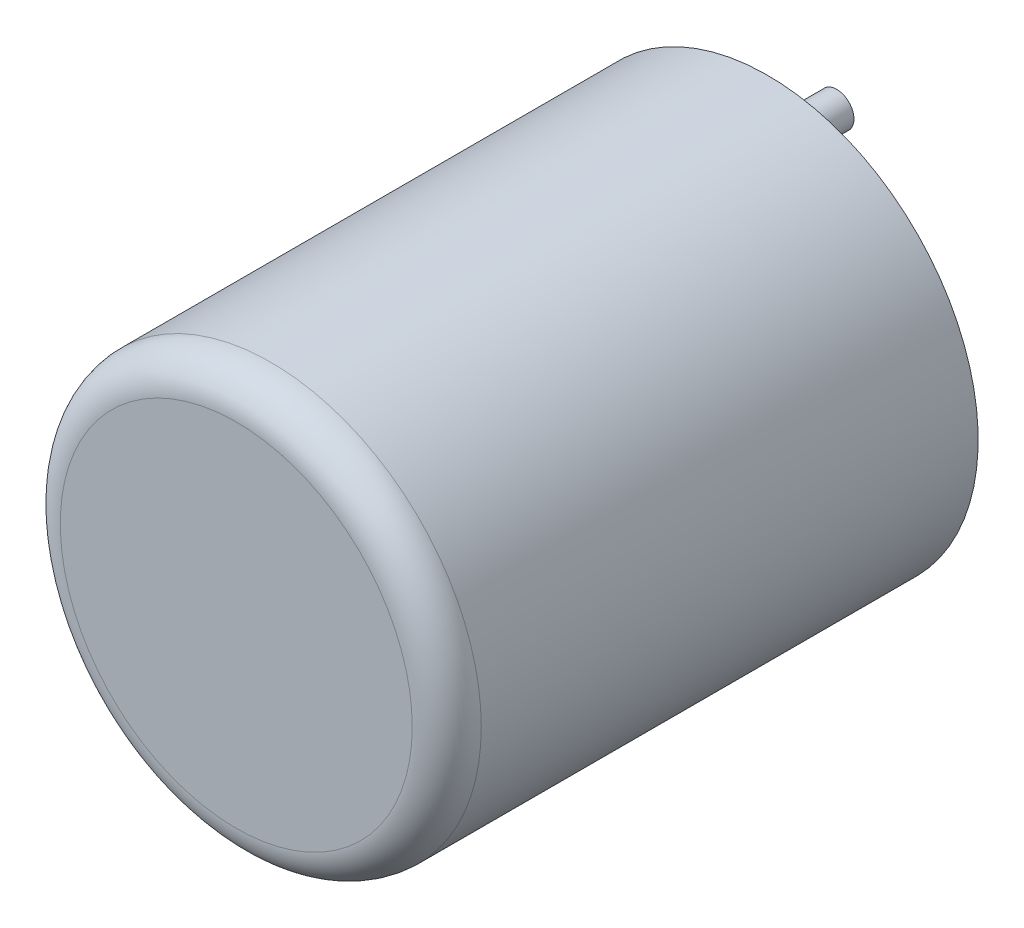
ISO-10303-21;
HEADER;
FILE_DESCRIPTION(('STEP AP214'),'2;1');
FILE_NAME('part.step','',(''),(''),'','','');
FILE_SCHEMA(('AUTOMOTIVE_DESIGN { 1 0 10303 214 1 1 1 1 }'));
ENDSEC;
DATA;
#1=APPLICATION_CONTEXT('core data for automotive mechanical design processes');
#2=APPLICATION_PROTOCOL_DEFINITION('international standard','automotive_design',2000,#1);
#3=PRODUCT_CONTEXT('',#1,'mechanical');
#4=PRODUCT('Part','Part','',(#3));
#5=PRODUCT_RELATED_PRODUCT_CATEGORY('part','',(#4));
#6=PRODUCT_DEFINITION_FORMATION('','',#4);
#7=PRODUCT_DEFINITION_CONTEXT('part definition',#1,'design');
#8=PRODUCT_DEFINITION('design','',#6,#7);
#9=PRODUCT_DEFINITION_SHAPE('','',#8);
#10=(LENGTH_UNIT() NAMED_UNIT(*) SI_UNIT(.MILLI.,.METRE.));
#11=(NAMED_UNIT(*) PLANE_ANGLE_UNIT() SI_UNIT($,.RADIAN.));
#12=(NAMED_UNIT(*) SI_UNIT($,.STERADIAN.) SOLID_ANGLE_UNIT());
#13=UNCERTAINTY_MEASURE_WITH_UNIT(LENGTH_MEASURE(1.E-05),#10,'distance_accuracy_value','');
#14=(GEOMETRIC_REPRESENTATION_CONTEXT(3) GLOBAL_UNCERTAINTY_ASSIGNED_CONTEXT((#13)) GLOBAL_UNIT_ASSIGNED_CONTEXT((#10,
#11,#12)) REPRESENTATION_CONTEXT('',''));
#15=CARTESIAN_POINT('',(0.,0.,0.));
#16=DIRECTION('',(0.,0.,1.));
#17=DIRECTION('',(1.,0.,0.));
#18=AXIS2_PLACEMENT_3D('',#15,#16,#17);
#19=CARTESIAN_POINT('',(-8.1936925383308,-0.952172842774601,1.));
#20=DIRECTION('',(1.,0.,0.));
#21=DIRECTION('',(0.,0.,-1.));
#22=AXIS2_PLACEMENT_3D('',#19,#20,#21);
#23=PLANE('',#22);
#24=DIRECTION('',(0.,-1.,0.));
#25=VECTOR('',#24,1.);
#26=CARTESIAN_POINT('',(-8.1936925383308,-0.952172842774601,0.));
#27=LINE('',#26,#25);
#28=CARTESIAN_POINT('',(-8.1936925383308,0.908629949780249,0.));
#29=VERTEX_POINT('',#28);
#30=CARTESIAN_POINT('',(-8.1936925383308,0.147366365258694,0.));
#31=VERTEX_POINT('',#30);
#32=EDGE_CURVE('E289',#29,#31,#27,.T.);
#33=ORIENTED_EDGE('',*,*,#32,.T.);
#34=DIRECTION('',(0.,0.,1.));
#35=VECTOR('',#34,1.);
#36=CARTESIAN_POINT('',(-8.1936925383308,0.147366365258694,1.));
#37=LINE('',#36,#35);
#38=CARTESIAN_POINT('',(-8.1936925383308,0.147366365258694,1.));
#39=VERTEX_POINT('',#38);
#40=EDGE_CURVE('E267',#31,#39,#37,.T.);
#41=ORIENTED_EDGE('',*,*,#40,.T.);
#42=DIRECTION('',(0.,-1.,0.));
#43=VECTOR('',#42,1.);
#44=CARTESIAN_POINT('',(-8.1936925383308,-0.952172842774601,1.));
#45=LINE('',#44,#43);
#46=CARTESIAN_POINT('',(-8.1936925383308,0.908629949780249,1.));
#47=VERTEX_POINT('',#46);
#48=EDGE_CURVE('E272',#47,#39,#45,.T.);
#49=ORIENTED_EDGE('',*,*,#48,.F.);
#50=DIRECTION('',(0.,0.,-1.));
#51=VECTOR('',#50,1.);
#52=CARTESIAN_POINT('',(-8.1936925383308,0.908629949780249,1.));
#53=LINE('',#52,#51);
#54=EDGE_CURVE('E306',#47,#29,#53,.T.);
#55=ORIENTED_EDGE('',*,*,#54,.T.);
#56=EDGE_LOOP('',(#33,#41,#49,#55));
#57=FACE_BOUND('',#56,.T.);
#58=ADVANCED_FACE('F39',(#57),#23,.F.);
#59=CARTESIAN_POINT('',(-8.558580150692,-0.952172842774601,1.));
#60=DIRECTION('',(-1.,0.,0.));
#61=DIRECTION('',(0.,0.,1.));
#62=AXIS2_PLACEMENT_3D('',#59,#60,#61);
#63=PLANE('',#62);
#64=DIRECTION('',(0.,1.,0.));
#65=VECTOR('',#64,1.);
#66=CARTESIAN_POINT('',(-8.558580150692,-0.952172842774601,1.));
#67=LINE('',#66,#65);
#68=CARTESIAN_POINT('',(-8.558580150692,0.147366365258694,1.));
#69=VERTEX_POINT('',#68);
#70=CARTESIAN_POINT('',(-8.558580150692,0.908629949780249,1.));
#71=VERTEX_POINT('',#70);
#72=EDGE_CURVE('E280',#69,#71,#67,.T.);
#73=ORIENTED_EDGE('',*,*,#72,.F.);
#74=DIRECTION('',(0.,0.,-1.));
#75=VECTOR('',#74,1.);
#76=CARTESIAN_POINT('',(-8.558580150692,0.147366365258694,1.));
#77=LINE('',#76,#75);
#78=CARTESIAN_POINT('',(-8.558580150692,0.147366365258694,0.));
#79=VERTEX_POINT('',#78);
#80=EDGE_CURVE('E263',#69,#79,#77,.T.);
#81=ORIENTED_EDGE('',*,*,#80,.T.);
#82=DIRECTION('',(0.,1.,0.));
#83=VECTOR('',#82,1.);
#84=CARTESIAN_POINT('',(-8.558580150692,-0.952172842774601,0.));
#85=LINE('',#84,#83);
#86=CARTESIAN_POINT('',(-8.558580150692,0.908629949780249,0.));
#87=VERTEX_POINT('',#86);
#88=EDGE_CURVE('E297',#79,#87,#85,.T.);
#89=ORIENTED_EDGE('',*,*,#88,.T.);
#90=DIRECTION('',(0.,0.,-1.));
#91=VECTOR('',#90,1.);
#92=CARTESIAN_POINT('',(-8.558580150692,0.908629949780249,1.));
#93=LINE('',#92,#91);
#94=EDGE_CURVE('E310',#71,#87,#93,.T.);
#95=ORIENTED_EDGE('',*,*,#94,.F.);
#96=EDGE_LOOP('',(#73,#81,#89,#95));
#97=FACE_BOUND('',#96,.T.);
#98=ADVANCED_FACE('F489',(#97),#63,.F.);
#99=CARTESIAN_POINT('',(9.44142083183763,0.190459875800464,1.));
#100=DIRECTION('',(0.,1.,0.));
#101=DIRECTION('',(0.,0.,1.));
#102=AXIS2_PLACEMENT_3D('',#99,#100,#101);
#103=PLANE('',#102);
#104=DIRECTION('',(1.,0.,0.));
#105=VECTOR('',#104,1.);
#106=CARTESIAN_POINT('',(9.44142083183763,0.190459875800464,1.));
#107=LINE('',#106,#105);
#108=CARTESIAN_POINT('',(8.65182786453733,0.190459875800464,1.));
#109=VERTEX_POINT('',#108);
#110=CARTESIAN_POINT('',(9.44142083183763,0.190459875800464,1.));
#111=VERTEX_POINT('',#110);
#112=EDGE_CURVE('E396',#109,#111,#107,.T.);
#113=ORIENTED_EDGE('',*,*,#112,.F.);
#114=DIRECTION('',(0.,0.,-1.));
#115=VECTOR('',#114,1.);
#116=CARTESIAN_POINT('',(8.65182786453733,0.190459875800464,1.));
#117=LINE('',#116,#115);
#118=CARTESIAN_POINT('',(8.65182786453733,0.190459875800464,0.));
#119=VERTEX_POINT('',#118);
#120=EDGE_CURVE('E377',#109,#119,#117,.T.);
#121=ORIENTED_EDGE('',*,*,#120,.T.);
#122=DIRECTION('',(1.,0.,0.));
#123=VECTOR('',#122,1.);
#124=CARTESIAN_POINT('',(9.44142083183763,0.190459875800464,0.));
#125=LINE('',#124,#123);
#126=CARTESIAN_POINT('',(9.44142083183763,0.190459875800464,0.));
#127=VERTEX_POINT('',#126);
#128=EDGE_CURVE('E413',#119,#127,#125,.T.);
#129=ORIENTED_EDGE('',*,*,#128,.T.);
#130=DIRECTION('',(0.,0.,-1.));
#131=VECTOR('',#130,1.);
#132=CARTESIAN_POINT('',(9.44142083183763,0.190459875800464,1.));
#133=LINE('',#132,#131);
#134=EDGE_CURVE('E417',#111,#127,#133,.T.);
#135=ORIENTED_EDGE('',*,*,#134,.F.);
#136=EDGE_LOOP('',(#113,#121,#129,#135));
#137=FACE_BOUND('',#136,.T.);
#138=ADVANCED_FACE('F484',(#137),#103,.F.);
#139=CARTESIAN_POINT('',(9.44142083183763,-0.163868755262531,1.));
#140=DIRECTION('',(0.,-1.,0.));
#141=DIRECTION('',(0.,0.,-1.));
#142=AXIS2_PLACEMENT_3D('',#139,#140,#141);
#143=PLANE('',#142);
#144=DIRECTION('',(-1.,0.,0.));
#145=VECTOR('',#144,1.);
#146=CARTESIAN_POINT('',(9.44142083183763,-0.163868755262531,0.));
#147=LINE('',#146,#145);
#148=CARTESIAN_POINT('',(9.44142083183763,-0.163868755262531,0.));
#149=VERTEX_POINT('',#148);
#150=CARTESIAN_POINT('',(8.65182786453733,-0.163868755262531,0.));
#151=VERTEX_POINT('',#150);
#152=EDGE_CURVE('E405',#149,#151,#147,.T.);
#153=ORIENTED_EDGE('',*,*,#152,.T.);
#154=DIRECTION('',(0.,0.,1.));
#155=VECTOR('',#154,1.);
#156=CARTESIAN_POINT('',(8.65182786453733,-0.163868755262531,1.));
#157=LINE('',#156,#155);
#158=CARTESIAN_POINT('',(8.65182786453733,-0.163868755262531,1.));
#159=VERTEX_POINT('',#158);
#160=EDGE_CURVE('E373',#151,#159,#157,.T.);
#161=ORIENTED_EDGE('',*,*,#160,.T.);
#162=DIRECTION('',(-1.,0.,0.));
#163=VECTOR('',#162,1.);
#164=CARTESIAN_POINT('',(9.44142083183763,-0.163868755262531,1.));
#165=LINE('',#164,#163);
#166=CARTESIAN_POINT('',(9.44142083183763,-0.163868755262531,1.));
#167=VERTEX_POINT('',#166);
#168=EDGE_CURVE('E388',#167,#159,#165,.T.);
#169=ORIENTED_EDGE('',*,*,#168,.F.);
#170=DIRECTION('',(0.,0.,-1.));
#171=VECTOR('',#170,1.);
#172=CARTESIAN_POINT('',(9.44142083183763,-0.163868755262531,1.));
#173=LINE('',#172,#171);
#174=EDGE_CURVE('E401',#167,#149,#173,.T.);
#175=ORIENTED_EDGE('',*,*,#174,.T.);
#176=EDGE_LOOP('',(#153,#161,#169,#175));
#177=FACE_BOUND('',#176,.T.);
#178=ADVANCED_FACE('F476',(#177),#143,.F.);
#179=CARTESIAN_POINT('',(0.,0.,30.8));
#180=DIRECTION('',(0.,0.,-1.));
#181=DIRECTION('',(-1.,0.,0.));
#182=AXIS2_PLACEMENT_3D('',#179,#180,#181);
#183=CYLINDRICAL_SURFACE('',#182,12.2);
#184=CARTESIAN_POINT('',(0.,0.,28.8));
#185=DIRECTION('',(0.,0.,1.));
#186=DIRECTION('',(1.,0.,0.));
#187=AXIS2_PLACEMENT_3D('',#184,#185,#186);
#188=CIRCLE('',#187,12.2);
#189=CARTESIAN_POINT('',(-12.2,0.,28.8));
#190=VERTEX_POINT('',#189);
#191=EDGE_CURVE('E448',#190,#190,#188,.F.);
#192=CARTESIAN_POINT('',(0.,0.,0.));
#193=DIRECTION('',(0.,0.,1.));
#194=DIRECTION('',(1.,0.,0.));
#195=AXIS2_PLACEMENT_3D('',#192,#193,#194);
#196=CIRCLE('',#195,12.2);
#197=CARTESIAN_POINT('',(-12.2,0.,0.));
#198=VERTEX_POINT('',#197);
#199=EDGE_CURVE('E443',#198,#198,#196,.T.);
#200=CARTESIAN_POINT('',(-12.2,0.,28.8));
#201=CARTESIAN_POINT('',(-12.2,0.,28.5));
#202=CARTESIAN_POINT('',(-12.2,0.,28.2));
#203=CARTESIAN_POINT('',(-12.2,0.,27.6));
#204=CARTESIAN_POINT('',(-12.2,0.,27.3));
#205=CARTESIAN_POINT('',(-12.2,0.,26.7));
#206=CARTESIAN_POINT('',(-12.2,0.,26.4));
#207=CARTESIAN_POINT('',(-12.2,0.,25.8));
#208=CARTESIAN_POINT('',(-12.2,0.,25.5));
#209=CARTESIAN_POINT('',(-12.2,0.,24.9));
#210=CARTESIAN_POINT('',(-12.2,0.,24.6));
#211=CARTESIAN_POINT('',(-12.2,0.,24.));
#212=CARTESIAN_POINT('',(-12.2,0.,23.7));
#213=CARTESIAN_POINT('',(-12.2,0.,23.1));
#214=CARTESIAN_POINT('',(-12.2,0.,22.8));
#215=CARTESIAN_POINT('',(-12.2,0.,22.2));
#216=CARTESIAN_POINT('',(-12.2,0.,21.9));
#217=CARTESIAN_POINT('',(-12.2,0.,21.3));
#218=CARTESIAN_POINT('',(-12.2,0.,21.));
#219=CARTESIAN_POINT('',(-12.2,0.,20.4));
#220=CARTESIAN_POINT('',(-12.2,0.,20.1));
#221=CARTESIAN_POINT('',(-12.2,0.,19.5));
#222=CARTESIAN_POINT('',(-12.2,0.,19.2));
#223=CARTESIAN_POINT('',(-12.2,0.,18.6));
#224=CARTESIAN_POINT('',(-12.2,0.,18.3));
#225=CARTESIAN_POINT('',(-12.2,0.,17.7));
#226=CARTESIAN_POINT('',(-12.2,0.,17.4));
#227=CARTESIAN_POINT('',(-12.2,0.,16.8));
#228=CARTESIAN_POINT('',(-12.2,0.,16.5));
#229=CARTESIAN_POINT('',(-12.2,0.,15.9));
#230=CARTESIAN_POINT('',(-12.2,0.,15.6));
#231=CARTESIAN_POINT('',(-12.2,0.,15.));
#232=CARTESIAN_POINT('',(-12.2,0.,14.7));
#233=CARTESIAN_POINT('',(-12.2,0.,14.1));
#234=CARTESIAN_POINT('',(-12.2,0.,13.8));
#235=CARTESIAN_POINT('',(-12.2,0.,13.2));
#236=CARTESIAN_POINT('',(-12.2,0.,12.9));
#237=CARTESIAN_POINT('',(-12.2,0.,12.3));
#238=CARTESIAN_POINT('',(-12.2,0.,12.));
#239=CARTESIAN_POINT('',(-12.2,0.,11.4));
#240=CARTESIAN_POINT('',(-12.2,0.,11.1));
#241=CARTESIAN_POINT('',(-12.2,0.,10.5));
#242=CARTESIAN_POINT('',(-12.2,0.,10.2));
#243=CARTESIAN_POINT('',(-12.2,0.,9.6));
#244=CARTESIAN_POINT('',(-12.2,0.,9.3));
#245=CARTESIAN_POINT('',(-12.2,0.,8.7));
#246=CARTESIAN_POINT('',(-12.2,0.,8.4));
#247=CARTESIAN_POINT('',(-12.2,0.,7.8));
#248=CARTESIAN_POINT('',(-12.2,0.,7.5));
#249=CARTESIAN_POINT('',(-12.2,0.,6.9));
#250=CARTESIAN_POINT('',(-12.2,0.,6.6));
#251=CARTESIAN_POINT('',(-12.2,0.,6.));
#252=CARTESIAN_POINT('',(-12.2,0.,5.7));
#253=CARTESIAN_POINT('',(-12.2,0.,5.1));
#254=CARTESIAN_POINT('',(-12.2,0.,4.8));
#255=CARTESIAN_POINT('',(-12.2,0.,4.2));
#256=CARTESIAN_POINT('',(-12.2,0.,3.9));
#257=CARTESIAN_POINT('',(-12.2,0.,3.3));
#258=CARTESIAN_POINT('',(-12.2,0.,3.));
#259=CARTESIAN_POINT('',(-12.2,0.,2.4));
#260=CARTESIAN_POINT('',(-12.2,0.,2.1));
#261=CARTESIAN_POINT('',(-12.2,0.,1.5));
#262=CARTESIAN_POINT('',(-12.2,0.,1.2));
#263=CARTESIAN_POINT('',(-12.2,0.,0.599999999999997));
#264=CARTESIAN_POINT('',(-12.2,0.,0.299999999999996));
#265=CARTESIAN_POINT('',(-12.2,0.,0.));
#266=B_SPLINE_CURVE_WITH_KNOTS('',3,(#200,#201,#202,#203,#204,#205,#206,#207,#208,#209,#210,
#211,#212,#213,#214,#215,#216,#217,#218,#219,#220,#221,#222,#223,#224,#225,#226,#227,#228,#229,
#230,#231,#232,#233,#234,#235,#236,#237,#238,#239,#240,#241,#242,#243,#244,#245,#246,#247,#248,
#249,#250,#251,#252,#253,#254,#255,#256,#257,#258,#259,#260,#261,#262,#263,#264,#265),
.UNSPECIFIED.,.F.,.F.,(4,2,2,2,2,2,2,2,2,2,2,2,2,2,2,2,2,2,2,2,2,2,2,2,2,2,2,2,2,2,2,2,4),(0.,
0.899999999999998,1.8,2.7,3.6,4.5,5.4,6.3,7.2,8.1,9.,9.9,10.8,11.7,12.6,13.5,14.4,15.3,16.2,
17.1,18.,18.9,19.8,20.7,21.6,22.5,23.4,24.3,25.2,26.1,27.,27.9,28.8),.UNSPECIFIED.);
#267=EDGE_CURVE('BSEAM474',#190,#198,#266,.T.);
#268=ORIENTED_EDGE('',*,*,#191,.T.);
#269=ORIENTED_EDGE('',*,*,#199,.T.);
#270=ORIENTED_EDGE('',*,*,#267,.T.);
#271=ORIENTED_EDGE('',*,*,#267,.F.);
#272=EDGE_LOOP('',(#268,#270,#269,#271));
#273=FACE_BOUND('',#272,.T.);
#274=ADVANCED_FACE('F474',(#273),#183,.T.);
#275=CARTESIAN_POINT('',(0.,0.,30.8));
#276=DIRECTION('',(0.,0.,1.));
#277=DIRECTION('',(1.,0.,0.));
#278=AXIS2_PLACEMENT_3D('',#275,#276,#277);
#279=PLANE('',#278);
#280=CARTESIAN_POINT('',(0.,0.,30.8));
#281=DIRECTION('',(0.,0.,1.));
#282=DIRECTION('',(1.,0.,0.));
#283=AXIS2_PLACEMENT_3D('',#280,#281,#282);
#284=CIRCLE('',#283,10.2);
#285=CARTESIAN_POINT('',(10.2,0.,30.8));
#286=VERTEX_POINT('',#285);
#287=EDGE_CURVE('E452',#286,#286,#284,.T.);
#288=ORIENTED_EDGE('',*,*,#287,.T.);
#289=EDGE_LOOP('',(#288));
#290=FACE_BOUND('',#289,.T.);
#291=ADVANCED_FACE('F467',(#290),#279,.T.);
#292=CARTESIAN_POINT('',(0.,0.,0.));
#293=DIRECTION('',(0.,0.,1.));
#294=DIRECTION('',(1.,0.,0.));
#295=AXIS2_PLACEMENT_3D('',#292,#293,#294);
#296=PLANE('',#295);
#297=ORIENTED_EDGE('',*,*,#88,.F.);
#298=DIRECTION('',(1.,0.,0.));
#299=VECTOR('',#298,1.);
#300=CARTESIAN_POINT('',(-7.38071404325069,0.147366365258694,0.));
#301=LINE('',#300,#299);
#302=CARTESIAN_POINT('',(-9.35623774293504,0.147366365258694,0.));
#303=VERTEX_POINT('',#302);
#304=EDGE_CURVE('E227',#303,#79,#301,.T.);
#305=ORIENTED_EDGE('',*,*,#304,.F.);
#306=DIRECTION('',(0.,1.,0.));
#307=VECTOR('',#306,1.);
#308=CARTESIAN_POINT('',(-9.35623774293504,-0.233305350152424,0.));
#309=LINE('',#308,#307);
#310=CARTESIAN_POINT('',(-9.35623774293504,-0.233305350152424,0.));
#311=VERTEX_POINT('',#310);
#312=EDGE_CURVE('E244',#311,#303,#309,.T.);
#313=ORIENTED_EDGE('',*,*,#312,.F.);
#314=DIRECTION('',(-1.,0.,0.));
#315=VECTOR('',#314,1.);
#316=CARTESIAN_POINT('',(-7.38071404325069,-0.233305350152424,0.));
#317=LINE('',#316,#315);
#318=CARTESIAN_POINT('',(-8.558580150692,-0.233305350152424,0.));
#319=VERTEX_POINT('',#318);
#320=EDGE_CURVE('E240',#319,#311,#317,.T.);
#321=ORIENTED_EDGE('',*,*,#320,.F.);
#322=CARTESIAN_POINT('',(-8.558580150692,-0.952172842774601,0.));
#323=VERTEX_POINT('',#322);
#324=EDGE_CURVE('E298',#323,#319,#85,.T.);
#325=ORIENTED_EDGE('',*,*,#324,.F.);
#326=DIRECTION('',(-1.,0.,0.));
#327=VECTOR('',#326,1.);
#328=CARTESIAN_POINT('',(-8.1936925383308,-0.952172842774601,0.));
#329=LINE('',#328,#327);
#330=CARTESIAN_POINT('',(-8.1936925383308,-0.952172842774601,0.));
#331=VERTEX_POINT('',#330);
#332=EDGE_CURVE('E293',#331,#323,#329,.T.);
#333=ORIENTED_EDGE('',*,*,#332,.F.);
#334=CARTESIAN_POINT('',(-8.1936925383308,-0.233305350152424,0.));
#335=VERTEX_POINT('',#334);
#336=EDGE_CURVE('E271',#335,#331,#27,.T.);
#337=ORIENTED_EDGE('',*,*,#336,.F.);
#338=CARTESIAN_POINT('',(-7.38071404325069,-0.233305350152424,0.));
#339=VERTEX_POINT('',#338);
#340=EDGE_CURVE('E241',#339,#335,#317,.T.);
#341=ORIENTED_EDGE('',*,*,#340,.F.);
#342=DIRECTION('',(0.,-1.,0.));
#343=VECTOR('',#342,1.);
#344=CARTESIAN_POINT('',(-7.38071404325069,-0.233305350152424,0.));
#345=LINE('',#344,#343);
#346=CARTESIAN_POINT('',(-7.38071404325069,0.147366365258694,0.));
#347=VERTEX_POINT('',#346);
#348=EDGE_CURVE('E207',#347,#339,#345,.T.);
#349=ORIENTED_EDGE('',*,*,#348,.F.);
#350=EDGE_CURVE('E231',#31,#347,#301,.T.);
#351=ORIENTED_EDGE('',*,*,#350,.F.);
#352=ORIENTED_EDGE('',*,*,#32,.F.);
#353=DIRECTION('',(1.,0.,0.));
#354=VECTOR('',#353,1.);
#355=CARTESIAN_POINT('',(-8.1936925383308,0.908629949780249,0.));
#356=LINE('',#355,#354);
#357=EDGE_CURVE('E302',#87,#29,#356,.T.);
#358=ORIENTED_EDGE('',*,*,#357,.F.);
#359=EDGE_LOOP('',(#297,#305,#313,#321,#325,#333,#337,#341,#349,#351,#352,#358));
#360=FACE_BOUND('',#359,.T.);
#361=ORIENTED_EDGE('',*,*,#128,.F.);
#362=DIRECTION('',(0.,-1.,0.));
#363=VECTOR('',#362,1.);
#364=CARTESIAN_POINT('',(8.65182786453733,-0.910499561523892,0.));
#365=LINE('',#364,#363);
#366=CARTESIAN_POINT('',(8.65182786453733,0.883468192625969,0.));
#367=VERTEX_POINT('',#366);
#368=EDGE_CURVE('E337',#367,#119,#365,.T.);
#369=ORIENTED_EDGE('',*,*,#368,.F.);
#370=DIRECTION('',(1.,0.,0.));
#371=VECTOR('',#370,1.);
#372=CARTESIAN_POINT('',(8.65182786453733,0.883468192625969,0.));
#373=LINE('',#372,#371);
#374=CARTESIAN_POINT('',(8.33433943587369,0.883468192625969,0.));
#375=VERTEX_POINT('',#374);
#376=EDGE_CURVE('E348',#375,#367,#373,.T.);
#377=ORIENTED_EDGE('',*,*,#376,.F.);
#378=DIRECTION('',(0.,1.,0.));
#379=VECTOR('',#378,1.);
#380=CARTESIAN_POINT('',(8.33433943587369,-0.910499561523892,0.));
#381=LINE('',#380,#379);
#382=CARTESIAN_POINT('',(8.33433943587369,0.190459875800464,0.));
#383=VERTEX_POINT('',#382);
#384=EDGE_CURVE('E344',#383,#375,#381,.T.);
#385=ORIENTED_EDGE('',*,*,#384,.F.);
#386=CARTESIAN_POINT('',(7.59017221557201,0.190459875800464,0.));
#387=VERTEX_POINT('',#386);
#388=EDGE_CURVE('E387',#387,#383,#125,.T.);
#389=ORIENTED_EDGE('',*,*,#388,.F.);
#390=DIRECTION('',(0.,1.,0.));
#391=VECTOR('',#390,1.);
#392=CARTESIAN_POINT('',(7.59017221557201,-0.163868755262531,0.));
#393=LINE('',#392,#391);
#394=CARTESIAN_POINT('',(7.59017221557201,-0.163868755262531,0.));
#395=VERTEX_POINT('',#394);
#396=EDGE_CURVE('E409',#395,#387,#393,.T.);
#397=ORIENTED_EDGE('',*,*,#396,.F.);
#398=CARTESIAN_POINT('',(8.33433943587369,-0.163868755262531,0.));
#399=VERTEX_POINT('',#398);
#400=EDGE_CURVE('E404',#399,#395,#147,.T.);
#401=ORIENTED_EDGE('',*,*,#400,.F.);
#402=CARTESIAN_POINT('',(8.33433943587369,-0.910499561523892,0.));
#403=VERTEX_POINT('',#402);
#404=EDGE_CURVE('E345',#403,#399,#381,.T.);
#405=ORIENTED_EDGE('',*,*,#404,.F.);
#406=DIRECTION('',(-1.,0.,0.));
#407=VECTOR('',#406,1.);
#408=CARTESIAN_POINT('',(8.65182786453733,-0.910499561523892,0.));
#409=LINE('',#408,#407);
#410=CARTESIAN_POINT('',(8.65182786453733,-0.910499561523892,0.));
#411=VERTEX_POINT('',#410);
#412=EDGE_CURVE('E340',#411,#403,#409,.T.);
#413=ORIENTED_EDGE('',*,*,#412,.F.);
#414=EDGE_CURVE('E309',#151,#411,#365,.T.);
#415=ORIENTED_EDGE('',*,*,#414,.F.);
#416=ORIENTED_EDGE('',*,*,#152,.F.);
#417=DIRECTION('',(0.,-1.,0.));
#418=VECTOR('',#417,1.);
#419=CARTESIAN_POINT('',(9.44142083183763,-0.163868755262531,0.));
#420=LINE('',#419,#418);
#421=EDGE_CURVE('E381',#127,#149,#420,.T.);
#422=ORIENTED_EDGE('',*,*,#421,.F.);
#423=EDGE_LOOP('',(#361,#369,#377,#385,#389,#397,#401,#405,#413,#415,#416,#422));
#424=FACE_BOUND('',#423,.T.);
#425=CARTESIAN_POINT('',(0.,8.5,0.));
#426=DIRECTION('',(0.,0.,1.));
#427=DIRECTION('',(1.,0.,0.));
#428=AXIS2_PLACEMENT_3D('',#425,#426,#427);
#429=CIRCLE('',#428,1.);
#430=CARTESIAN_POINT('',(1.,8.5,0.));
#431=VERTEX_POINT('',#430);
#432=EDGE_CURVE('E11',#431,#431,#429,.F.);
#433=ORIENTED_EDGE('',*,*,#432,.F.);
#434=EDGE_LOOP('',(#433));
#435=FACE_BOUND('',#434,.T.);
#436=CARTESIAN_POINT('',(0.,-8.5,0.));
#437=DIRECTION('',(0.,0.,1.));
#438=DIRECTION('',(1.,0.,0.));
#439=AXIS2_PLACEMENT_3D('',#436,#437,#438);
#440=CIRCLE('',#439,1.);
#441=CARTESIAN_POINT('',(1.,-8.5,0.));
#442=VERTEX_POINT('',#441);
#443=EDGE_CURVE('E48',#442,#442,#440,.F.);
#444=ORIENTED_EDGE('',*,*,#443,.F.);
#445=EDGE_LOOP('',(#444));
#446=FACE_BOUND('',#445,.T.);
#447=CARTESIAN_POINT('',(0.,0.,0.));
#448=DIRECTION('',(0.,0.,-1.));
#449=DIRECTION('',(-1.,0.,0.));
#450=AXIS2_PLACEMENT_3D('',#447,#448,#449);
#451=CIRCLE('',#450,3.25);
#452=CARTESIAN_POINT('',(-3.25,0.,0.));
#453=VERTEX_POINT('',#452);
#454=EDGE_CURVE('E444',#453,#453,#451,.T.);
#455=ORIENTED_EDGE('',*,*,#454,.F.);
#456=EDGE_LOOP('',(#455));
#457=FACE_BOUND('',#456,.T.);
#458=ORIENTED_EDGE('',*,*,#199,.F.);
#459=EDGE_LOOP('',(#458));
#460=FACE_BOUND('',#459,.T.);
#461=ADVANCED_FACE('F464',(#360,#424,#435,#446,#457,#460),#296,.F.);
#462=CARTESIAN_POINT('',(0.,0.,28.8));
#463=DIRECTION('',(0.,0.,1.));
#464=DIRECTION('',(1.,0.,0.));
#465=AXIS2_PLACEMENT_3D('',#462,#463,#464);
#466=TOROIDAL_SURFACE('',#465,10.2,2.);
#467=ORIENTED_EDGE('',*,*,#191,.F.);
#468=EDGE_LOOP('',(#467));
#469=FACE_BOUND('',#468,.T.);
#470=ORIENTED_EDGE('',*,*,#287,.F.);
#471=EDGE_LOOP('',(#470));
#472=FACE_BOUND('',#471,.T.);
#473=ADVANCED_FACE('F41',(#469,#472),#466,.T.);
#474=CARTESIAN_POINT('',(0.,0.,-1.7));
#475=DIRECTION('',(0.,0.,1.));
#476=DIRECTION('',(1.,0.,0.));
#477=AXIS2_PLACEMENT_3D('',#474,#475,#476);
#478=CYLINDRICAL_SURFACE('',#477,3.25);
#479=CARTESIAN_POINT('',(0.,0.,-1.7));
#480=DIRECTION('',(0.,0.,-1.));
#481=DIRECTION('',(-1.,0.,0.));
#482=AXIS2_PLACEMENT_3D('',#479,#480,#481);
#483=CIRCLE('',#482,3.25);
#484=CARTESIAN_POINT('',(-3.25,0.,-1.7));
#485=VERTEX_POINT('',#484);
#486=EDGE_CURVE('E439',#485,#485,#483,.T.);
#487=ORIENTED_EDGE('',*,*,#486,.F.);
#488=EDGE_LOOP('',(#487));
#489=FACE_BOUND('',#488,.T.);
#490=ORIENTED_EDGE('',*,*,#454,.T.);
#491=EDGE_LOOP('',(#490));
#492=FACE_BOUND('',#491,.T.);
#493=ADVANCED_FACE('F624',(#489,#492),#478,.T.);
#494=CARTESIAN_POINT('',(0.,0.,-1.7));
#495=DIRECTION('',(0.,0.,-1.));
#496=DIRECTION('',(-1.,0.,0.));
#497=AXIS2_PLACEMENT_3D('',#494,#495,#496);
#498=PLANE('',#497);
#499=ORIENTED_EDGE('',*,*,#486,.T.);
#500=EDGE_LOOP('',(#499));
#501=FACE_BOUND('',#500,.T.);
#502=ADVANCED_FACE('F620',(#501),#498,.T.);
#503=CARTESIAN_POINT('',(0.,-8.5,-4.));
#504=DIRECTION('',(0.,0.,1.));
#505=DIRECTION('',(1.,0.,0.));
#506=AXIS2_PLACEMENT_3D('',#503,#504,#505);
#507=CYLINDRICAL_SURFACE('',#506,1.);
#508=CARTESIAN_POINT('',(0.,-8.5,-4.));
#509=DIRECTION('',(0.,0.,-1.));
#510=DIRECTION('',(-1.,0.,0.));
#511=AXIS2_PLACEMENT_3D('',#508,#509,#510);
#512=CIRCLE('',#511,1.);
#513=CARTESIAN_POINT('',(-1.,-8.5,-4.));
#514=VERTEX_POINT('',#513);
#515=EDGE_CURVE('E435',#514,#514,#512,.T.);
#516=ORIENTED_EDGE('',*,*,#515,.F.);
#517=EDGE_LOOP('',(#516));
#518=FACE_BOUND('',#517,.T.);
#519=ORIENTED_EDGE('',*,*,#443,.T.);
#520=EDGE_LOOP('',(#519));
#521=FACE_BOUND('',#520,.T.);
#522=ADVANCED_FACE('F462',(#518,#521),#507,.T.);
#523=CARTESIAN_POINT('',(0.,-8.5,-4.));
#524=DIRECTION('',(0.,0.,-1.));
#525=DIRECTION('',(-1.,0.,0.));
#526=AXIS2_PLACEMENT_3D('',#523,#524,#525);
#527=PLANE('',#526);
#528=ORIENTED_EDGE('',*,*,#515,.T.);
#529=EDGE_LOOP('',(#528));
#530=FACE_BOUND('',#529,.T.);
#531=ADVANCED_FACE('F604',(#530),#527,.T.);
#532=CARTESIAN_POINT('',(0.,8.5,-4.));
#533=DIRECTION('',(0.,0.,1.));
#534=DIRECTION('',(1.,0.,0.));
#535=AXIS2_PLACEMENT_3D('',#532,#533,#534);
#536=CYLINDRICAL_SURFACE('',#535,1.);
#537=CARTESIAN_POINT('',(0.,8.5,-4.));
#538=DIRECTION('',(0.,0.,-1.));
#539=DIRECTION('',(-1.,0.,0.));
#540=AXIS2_PLACEMENT_3D('',#537,#538,#539);
#541=CIRCLE('',#540,1.);
#542=CARTESIAN_POINT('',(-1.,8.5,-4.));
#543=VERTEX_POINT('',#542);
#544=EDGE_CURVE('E421',#543,#543,#541,.T.);
#545=ORIENTED_EDGE('',*,*,#544,.F.);
#546=EDGE_LOOP('',(#545));
#547=FACE_BOUND('',#546,.T.);
#548=ORIENTED_EDGE('',*,*,#432,.T.);
#549=EDGE_LOOP('',(#548));
#550=FACE_BOUND('',#549,.T.);
#551=ADVANCED_FACE('F601',(#547,#550),#536,.T.);
#552=CARTESIAN_POINT('',(0.,8.5,-4.));
#553=DIRECTION('',(0.,0.,-1.));
#554=DIRECTION('',(-1.,0.,0.));
#555=AXIS2_PLACEMENT_3D('',#552,#553,#554);
#556=PLANE('',#555);
#557=ORIENTED_EDGE('',*,*,#544,.T.);
#558=EDGE_LOOP('',(#557));
#559=FACE_BOUND('',#558,.T.);
#560=ADVANCED_FACE('F603',(#559),#556,.T.);
#561=CARTESIAN_POINT('',(9.44142083183763,-0.163868755262531,1.));
#562=DIRECTION('',(1.,0.,0.));
#563=DIRECTION('',(0.,0.,-1.));
#564=AXIS2_PLACEMENT_3D('',#561,#562,#563);
#565=PLANE('',#564);
#566=ORIENTED_EDGE('',*,*,#421,.T.);
#567=ORIENTED_EDGE('',*,*,#174,.F.);
#568=DIRECTION('',(0.,-1.,0.));
#569=VECTOR('',#568,1.);
#570=CARTESIAN_POINT('',(9.44142083183763,-0.163868755262531,1.));
#571=LINE('',#570,#569);
#572=EDGE_CURVE('E382',#111,#167,#571,.T.);
#573=ORIENTED_EDGE('',*,*,#572,.F.);
#574=ORIENTED_EDGE('',*,*,#134,.T.);
#575=EDGE_LOOP('',(#566,#567,#573,#574));
#576=FACE_BOUND('',#575,.T.);
#577=ADVANCED_FACE('F562',(#576),#565,.F.);
#578=ORIENTED_EDGE('',*,*,#388,.T.);
#579=DIRECTION('',(0.,0.,1.));
#580=VECTOR('',#579,1.);
#581=CARTESIAN_POINT('',(8.33433943587369,0.190459875800464,1.));
#582=LINE('',#581,#580);
#583=CARTESIAN_POINT('',(8.33433943587369,0.190459875800464,1.));
#584=VERTEX_POINT('',#583);
#585=EDGE_CURVE('E369',#383,#584,#582,.T.);
#586=ORIENTED_EDGE('',*,*,#585,.T.);
#587=CARTESIAN_POINT('',(7.59017221557201,0.190459875800464,1.));
#588=VERTEX_POINT('',#587);
#589=EDGE_CURVE('E397',#588,#584,#107,.T.);
#590=ORIENTED_EDGE('',*,*,#589,.F.);
#591=DIRECTION('',(0.,0.,-1.));
#592=VECTOR('',#591,1.);
#593=CARTESIAN_POINT('',(7.59017221557201,0.190459875800464,1.));
#594=LINE('',#593,#592);
#595=EDGE_CURVE('E422',#588,#387,#594,.T.);
#596=ORIENTED_EDGE('',*,*,#595,.T.);
#597=EDGE_LOOP('',(#578,#586,#590,#596));
#598=FACE_BOUND('',#597,.T.);
#599=ADVANCED_FACE('F589',(#598),#103,.F.);
#600=CARTESIAN_POINT('',(7.59017221557201,-0.163868755262531,1.));
#601=DIRECTION('',(-1.,0.,0.));
#602=DIRECTION('',(0.,0.,1.));
#603=AXIS2_PLACEMENT_3D('',#600,#601,#602);
#604=PLANE('',#603);
#605=ORIENTED_EDGE('',*,*,#396,.T.);
#606=ORIENTED_EDGE('',*,*,#595,.F.);
#607=DIRECTION('',(0.,1.,0.));
#608=VECTOR('',#607,1.);
#609=CARTESIAN_POINT('',(7.59017221557201,-0.163868755262531,1.));
#610=LINE('',#609,#608);
#611=CARTESIAN_POINT('',(7.59017221557201,-0.163868755262531,1.));
#612=VERTEX_POINT('',#611);
#613=EDGE_CURVE('E392',#612,#588,#610,.T.);
#614=ORIENTED_EDGE('',*,*,#613,.F.);
#615=DIRECTION('',(0.,0.,-1.));
#616=VECTOR('',#615,1.);
#617=CARTESIAN_POINT('',(7.59017221557201,-0.163868755262531,1.));
#618=LINE('',#617,#616);
#619=EDGE_CURVE('E425',#612,#395,#618,.T.);
#620=ORIENTED_EDGE('',*,*,#619,.T.);
#621=EDGE_LOOP('',(#605,#606,#614,#620));
#622=FACE_BOUND('',#621,.T.);
#623=ADVANCED_FACE('F586',(#622),#604,.F.);
#624=CARTESIAN_POINT('',(8.33433943587369,-0.163868755262531,1.));
#625=VERTEX_POINT('',#624);
#626=EDGE_CURVE('E386',#625,#612,#165,.T.);
#627=ORIENTED_EDGE('',*,*,#626,.F.);
#628=DIRECTION('',(0.,0.,-1.));
#629=VECTOR('',#628,1.);
#630=CARTESIAN_POINT('',(8.33433943587369,-0.163868755262531,1.));
#631=LINE('',#630,#629);
#632=EDGE_CURVE('E355',#625,#399,#631,.T.);
#633=ORIENTED_EDGE('',*,*,#632,.T.);
#634=ORIENTED_EDGE('',*,*,#400,.T.);
#635=ORIENTED_EDGE('',*,*,#619,.F.);
#636=EDGE_LOOP('',(#627,#633,#634,#635));
#637=FACE_BOUND('',#636,.T.);
#638=ADVANCED_FACE('F487',(#637),#143,.F.);
#639=CARTESIAN_POINT('',(0.,0.,1.));
#640=DIRECTION('',(0.,0.,1.));
#641=DIRECTION('',(1.,0.,0.));
#642=AXIS2_PLACEMENT_3D('',#639,#640,#641);
#643=PLANE('',#642);
#644=ORIENTED_EDGE('',*,*,#589,.T.);
#645=DIRECTION('',(0.,1.,0.));
#646=VECTOR('',#645,1.);
#647=CARTESIAN_POINT('',(8.33433943587369,-0.910499561523892,1.));
#648=LINE('',#647,#646);
#649=CARTESIAN_POINT('',(8.33433943587369,0.883468192625969,1.));
#650=VERTEX_POINT('',#649);
#651=EDGE_CURVE('E328',#584,#650,#648,.T.);
#652=ORIENTED_EDGE('',*,*,#651,.T.);
#653=DIRECTION('',(1.,0.,0.));
#654=VECTOR('',#653,1.);
#655=CARTESIAN_POINT('',(8.65182786453733,0.883468192625969,1.));
#656=LINE('',#655,#654);
#657=CARTESIAN_POINT('',(8.65182786453733,0.883468192625969,1.));
#658=VERTEX_POINT('',#657);
#659=EDGE_CURVE('E332',#650,#658,#656,.T.);
#660=ORIENTED_EDGE('',*,*,#659,.T.);
#661=DIRECTION('',(0.,-1.,0.));
#662=VECTOR('',#661,1.);
#663=CARTESIAN_POINT('',(8.65182786453733,-0.910499561523892,1.));
#664=LINE('',#663,#662);
#665=EDGE_CURVE('E320',#658,#109,#664,.T.);
#666=ORIENTED_EDGE('',*,*,#665,.T.);
#667=ORIENTED_EDGE('',*,*,#112,.T.);
#668=ORIENTED_EDGE('',*,*,#572,.T.);
#669=ORIENTED_EDGE('',*,*,#168,.T.);
#670=CARTESIAN_POINT('',(8.65182786453733,-0.910499561523892,1.));
#671=VERTEX_POINT('',#670);
#672=EDGE_CURVE('E324',#159,#671,#664,.T.);
#673=ORIENTED_EDGE('',*,*,#672,.T.);
#674=DIRECTION('',(-1.,0.,0.));
#675=VECTOR('',#674,1.);
#676=CARTESIAN_POINT('',(8.65182786453733,-0.910499561523892,1.));
#677=LINE('',#676,#675);
#678=CARTESIAN_POINT('',(8.33433943587369,-0.910499561523892,1.));
#679=VERTEX_POINT('',#678);
#680=EDGE_CURVE('E323',#671,#679,#677,.T.);
#681=ORIENTED_EDGE('',*,*,#680,.T.);
#682=EDGE_CURVE('E329',#679,#625,#648,.T.);
#683=ORIENTED_EDGE('',*,*,#682,.T.);
#684=ORIENTED_EDGE('',*,*,#626,.T.);
#685=ORIENTED_EDGE('',*,*,#613,.T.);
#686=EDGE_LOOP('',(#644,#652,#660,#666,#667,#668,#669,#673,#681,#683,#684,#685));
#687=FACE_BOUND('',#686,.T.);
#688=ADVANCED_FACE('F554',(#687),#643,.F.);
#689=CARTESIAN_POINT('',(8.33433943587369,-0.910499561523892,1.));
#690=DIRECTION('',(-1.,0.,0.));
#691=DIRECTION('',(0.,0.,1.));
#692=AXIS2_PLACEMENT_3D('',#689,#690,#691);
#693=PLANE('',#692);
#694=ORIENTED_EDGE('',*,*,#682,.F.);
#695=DIRECTION('',(0.,0.,-1.));
#696=VECTOR('',#695,1.);
#697=CARTESIAN_POINT('',(8.33433943587369,-0.910499561523892,1.));
#698=LINE('',#697,#696);
#699=EDGE_CURVE('E360',#679,#403,#698,.T.);
#700=ORIENTED_EDGE('',*,*,#699,.T.);
#701=ORIENTED_EDGE('',*,*,#404,.T.);
#702=ORIENTED_EDGE('',*,*,#632,.F.);
#703=EDGE_LOOP('',(#694,#700,#701,#702));
#704=FACE_BOUND('',#703,.T.);
#705=ADVANCED_FACE('F577',(#704),#693,.F.);
#706=CARTESIAN_POINT('',(8.65182786453733,-0.910499561523892,1.));
#707=DIRECTION('',(1.,0.,0.));
#708=DIRECTION('',(0.,0.,-1.));
#709=AXIS2_PLACEMENT_3D('',#706,#707,#708);
#710=PLANE('',#709);
#711=ORIENTED_EDGE('',*,*,#414,.T.);
#712=DIRECTION('',(0.,0.,-1.));
#713=VECTOR('',#712,1.);
#714=CARTESIAN_POINT('',(8.65182786453733,-0.910499561523892,1.));
#715=LINE('',#714,#713);
#716=EDGE_CURVE('E336',#671,#411,#715,.T.);
#717=ORIENTED_EDGE('',*,*,#716,.F.);
#718=ORIENTED_EDGE('',*,*,#672,.F.);
#719=ORIENTED_EDGE('',*,*,#160,.F.);
#720=EDGE_LOOP('',(#711,#717,#718,#719));
#721=FACE_BOUND('',#720,.T.);
#722=ADVANCED_FACE('F568',(#721),#710,.F.);
#723=CARTESIAN_POINT('',(8.65182786453733,-0.910499561523892,1.));
#724=DIRECTION('',(0.,-1.,0.));
#725=DIRECTION('',(0.,0.,-1.));
#726=AXIS2_PLACEMENT_3D('',#723,#724,#725);
#727=PLANE('',#726);
#728=ORIENTED_EDGE('',*,*,#412,.T.);
#729=ORIENTED_EDGE('',*,*,#699,.F.);
#730=ORIENTED_EDGE('',*,*,#680,.F.);
#731=ORIENTED_EDGE('',*,*,#716,.T.);
#732=EDGE_LOOP('',(#728,#729,#730,#731));
#733=FACE_BOUND('',#732,.T.);
#734=ADVANCED_FACE('F572',(#733),#727,.F.);
#735=ORIENTED_EDGE('',*,*,#665,.F.);
#736=DIRECTION('',(0.,0.,-1.));
#737=VECTOR('',#736,1.);
#738=CARTESIAN_POINT('',(8.65182786453733,0.883468192625969,1.));
#739=LINE('',#738,#737);
#740=EDGE_CURVE('E352',#658,#367,#739,.T.);
#741=ORIENTED_EDGE('',*,*,#740,.T.);
#742=ORIENTED_EDGE('',*,*,#368,.T.);
#743=ORIENTED_EDGE('',*,*,#120,.F.);
#744=EDGE_LOOP('',(#735,#741,#742,#743));
#745=FACE_BOUND('',#744,.T.);
#746=ADVANCED_FACE('F597',(#745),#710,.F.);
#747=ORIENTED_EDGE('',*,*,#384,.T.);
#748=DIRECTION('',(0.,0.,-1.));
#749=VECTOR('',#748,1.);
#750=CARTESIAN_POINT('',(8.33433943587369,0.883468192625969,1.));
#751=LINE('',#750,#749);
#752=EDGE_CURVE('E356',#650,#375,#751,.T.);
#753=ORIENTED_EDGE('',*,*,#752,.F.);
#754=ORIENTED_EDGE('',*,*,#651,.F.);
#755=ORIENTED_EDGE('',*,*,#585,.F.);
#756=EDGE_LOOP('',(#747,#753,#754,#755));
#757=FACE_BOUND('',#756,.T.);
#758=ADVANCED_FACE('F511',(#757),#693,.F.);
#759=CARTESIAN_POINT('',(8.65182786453733,0.883468192625969,1.));
#760=DIRECTION('',(0.,1.,0.));
#761=DIRECTION('',(0.,0.,1.));
#762=AXIS2_PLACEMENT_3D('',#759,#760,#761);
#763=PLANE('',#762);
#764=ORIENTED_EDGE('',*,*,#376,.T.);
#765=ORIENTED_EDGE('',*,*,#740,.F.);
#766=ORIENTED_EDGE('',*,*,#659,.F.);
#767=ORIENTED_EDGE('',*,*,#752,.T.);
#768=EDGE_LOOP('',(#764,#765,#766,#767));
#769=FACE_BOUND('',#768,.T.);
#770=ADVANCED_FACE('F503',(#769),#763,.F.);
#771=CARTESIAN_POINT('',(-8.1936925383308,-0.233305350152424,1.));
#772=VERTEX_POINT('',#771);
#773=CARTESIAN_POINT('',(-8.1936925383308,-0.952172842774601,1.));
#774=VERTEX_POINT('',#773);
#775=EDGE_CURVE('E276',#772,#774,#45,.T.);
#776=ORIENTED_EDGE('',*,*,#775,.F.);
#777=DIRECTION('',(0.,0.,-1.));
#778=VECTOR('',#777,1.);
#779=CARTESIAN_POINT('',(-8.1936925383308,-0.233305350152424,1.));
#780=LINE('',#779,#778);
#781=EDGE_CURVE('E215',#772,#335,#780,.T.);
#782=ORIENTED_EDGE('',*,*,#781,.T.);
#783=ORIENTED_EDGE('',*,*,#336,.T.);
#784=DIRECTION('',(0.,0.,-1.));
#785=VECTOR('',#784,1.);
#786=CARTESIAN_POINT('',(-8.1936925383308,-0.952172842774601,1.));
#787=LINE('',#786,#785);
#788=EDGE_CURVE('E288',#774,#331,#787,.T.);
#789=ORIENTED_EDGE('',*,*,#788,.F.);
#790=EDGE_LOOP('',(#776,#782,#783,#789));
#791=FACE_BOUND('',#790,.T.);
#792=ADVANCED_FACE('F492',(#791),#23,.F.);
#793=CARTESIAN_POINT('',(-8.1936925383308,0.908629949780249,1.));
#794=DIRECTION('',(0.,1.,0.));
#795=DIRECTION('',(0.,0.,1.));
#796=AXIS2_PLACEMENT_3D('',#793,#794,#795);
#797=PLANE('',#796);
#798=ORIENTED_EDGE('',*,*,#357,.T.);
#799=ORIENTED_EDGE('',*,*,#54,.F.);
#800=DIRECTION('',(1.,0.,0.));
#801=VECTOR('',#800,1.);
#802=CARTESIAN_POINT('',(-8.1936925383308,0.908629949780249,1.));
#803=LINE('',#802,#801);
#804=EDGE_CURVE('E284',#71,#47,#803,.T.);
#805=ORIENTED_EDGE('',*,*,#804,.F.);
#806=ORIENTED_EDGE('',*,*,#94,.T.);
#807=EDGE_LOOP('',(#798,#799,#805,#806));
#808=FACE_BOUND('',#807,.T.);
#809=ADVANCED_FACE('F502',(#808),#797,.F.);
#810=ORIENTED_EDGE('',*,*,#324,.T.);
#811=DIRECTION('',(0.,0.,1.));
#812=VECTOR('',#811,1.);
#813=CARTESIAN_POINT('',(-8.558580150692,-0.233305350152424,1.));
#814=LINE('',#813,#812);
#815=CARTESIAN_POINT('',(-8.558580150692,-0.233305350152424,1.));
#816=VERTEX_POINT('',#815);
#817=EDGE_CURVE('E251',#319,#816,#814,.T.);
#818=ORIENTED_EDGE('',*,*,#817,.T.);
#819=CARTESIAN_POINT('',(-8.558580150692,-0.952172842774601,1.));
#820=VERTEX_POINT('',#819);
#821=EDGE_CURVE('E281',#820,#816,#67,.T.);
#822=ORIENTED_EDGE('',*,*,#821,.F.);
#823=DIRECTION('',(0.,0.,-1.));
#824=VECTOR('',#823,1.);
#825=CARTESIAN_POINT('',(-8.558580150692,-0.952172842774601,1.));
#826=LINE('',#825,#824);
#827=EDGE_CURVE('E314',#820,#323,#826,.T.);
#828=ORIENTED_EDGE('',*,*,#827,.T.);
#829=EDGE_LOOP('',(#810,#818,#822,#828));
#830=FACE_BOUND('',#829,.T.);
#831=ADVANCED_FACE('F498',(#830),#63,.F.);
#832=CARTESIAN_POINT('',(-8.1936925383308,-0.952172842774601,1.));
#833=DIRECTION('',(0.,-1.,0.));
#834=DIRECTION('',(0.,0.,-1.));
#835=AXIS2_PLACEMENT_3D('',#832,#833,#834);
#836=PLANE('',#835);
#837=ORIENTED_EDGE('',*,*,#332,.T.);
#838=ORIENTED_EDGE('',*,*,#827,.F.);
#839=DIRECTION('',(-1.,0.,0.));
#840=VECTOR('',#839,1.);
#841=CARTESIAN_POINT('',(-8.1936925383308,-0.952172842774601,1.));
#842=LINE('',#841,#840);
#843=EDGE_CURVE('E275',#774,#820,#842,.T.);
#844=ORIENTED_EDGE('',*,*,#843,.F.);
#845=ORIENTED_EDGE('',*,*,#788,.T.);
#846=EDGE_LOOP('',(#837,#838,#844,#845));
#847=FACE_BOUND('',#846,.T.);
#848=ADVANCED_FACE('F522',(#847),#836,.F.);
#849=CARTESIAN_POINT('',(0.,0.,1.));
#850=DIRECTION('',(0.,0.,1.));
#851=DIRECTION('',(1.,0.,0.));
#852=AXIS2_PLACEMENT_3D('',#849,#850,#851);
#853=PLANE('',#852);
#854=ORIENTED_EDGE('',*,*,#821,.T.);
#855=DIRECTION('',(-1.,0.,0.));
#856=VECTOR('',#855,1.);
#857=CARTESIAN_POINT('',(-7.38071404325069,-0.233305350152424,1.));
#858=LINE('',#857,#856);
#859=CARTESIAN_POINT('',(-9.35623774293504,-0.233305350152424,1.));
#860=VERTEX_POINT('',#859);
#861=EDGE_CURVE('E219',#816,#860,#858,.T.);
#862=ORIENTED_EDGE('',*,*,#861,.T.);
#863=DIRECTION('',(0.,1.,0.));
#864=VECTOR('',#863,1.);
#865=CARTESIAN_POINT('',(-9.35623774293504,-0.233305350152424,1.));
#866=LINE('',#865,#864);
#867=CARTESIAN_POINT('',(-9.35623774293504,0.147366365258694,1.));
#868=VERTEX_POINT('',#867);
#869=EDGE_CURVE('E218',#860,#868,#866,.T.);
#870=ORIENTED_EDGE('',*,*,#869,.T.);
#871=DIRECTION('',(1.,0.,0.));
#872=VECTOR('',#871,1.);
#873=CARTESIAN_POINT('',(-7.38071404325069,0.147366365258694,1.));
#874=LINE('',#873,#872);
#875=EDGE_CURVE('E55',#868,#69,#874,.T.);
#876=ORIENTED_EDGE('',*,*,#875,.T.);
#877=ORIENTED_EDGE('',*,*,#72,.T.);
#878=ORIENTED_EDGE('',*,*,#804,.T.);
#879=ORIENTED_EDGE('',*,*,#48,.T.);
#880=CARTESIAN_POINT('',(-7.38071404325069,0.147366365258694,1.));
#881=VERTEX_POINT('',#880);
#882=EDGE_CURVE('E224',#39,#881,#874,.T.);
#883=ORIENTED_EDGE('',*,*,#882,.T.);
#884=DIRECTION('',(0.,-1.,0.));
#885=VECTOR('',#884,1.);
#886=CARTESIAN_POINT('',(-7.38071404325069,-0.233305350152424,1.));
#887=LINE('',#886,#885);
#888=CARTESIAN_POINT('',(-7.38071404325069,-0.233305350152424,1.));
#889=VERTEX_POINT('',#888);
#890=EDGE_CURVE('E205',#881,#889,#887,.T.);
#891=ORIENTED_EDGE('',*,*,#890,.T.);
#892=EDGE_CURVE('E62',#889,#772,#858,.T.);
#893=ORIENTED_EDGE('',*,*,#892,.T.);
#894=ORIENTED_EDGE('',*,*,#775,.T.);
#895=ORIENTED_EDGE('',*,*,#843,.T.);
#896=EDGE_LOOP('',(#854,#862,#870,#876,#877,#878,#879,#883,#891,#893,#894,#895));
#897=FACE_BOUND('',#896,.T.);
#898=ADVANCED_FACE('F222',(#897),#853,.F.);
#899=CARTESIAN_POINT('',(-7.38071404325069,-0.233305350152424,1.));
#900=DIRECTION('',(0.,-1.,0.));
#901=DIRECTION('',(0.,0.,-1.));
#902=AXIS2_PLACEMENT_3D('',#899,#900,#901);
#903=PLANE('',#902);
#904=ORIENTED_EDGE('',*,*,#320,.T.);
#905=DIRECTION('',(0.,0.,-1.));
#906=VECTOR('',#905,1.);
#907=CARTESIAN_POINT('',(-9.35623774293504,-0.233305350152424,1.));
#908=LINE('',#907,#906);
#909=EDGE_CURVE('E211',#860,#311,#908,.T.);
#910=ORIENTED_EDGE('',*,*,#909,.F.);
#911=ORIENTED_EDGE('',*,*,#861,.F.);
#912=ORIENTED_EDGE('',*,*,#817,.F.);
#913=EDGE_LOOP('',(#904,#910,#911,#912));
#914=FACE_BOUND('',#913,.T.);
#915=ADVANCED_FACE('F533',(#914),#903,.F.);
#916=CARTESIAN_POINT('',(-7.38071404325069,0.147366365258694,1.));
#917=DIRECTION('',(0.,1.,0.));
#918=DIRECTION('',(0.,0.,1.));
#919=AXIS2_PLACEMENT_3D('',#916,#917,#918);
#920=PLANE('',#919);
#921=ORIENTED_EDGE('',*,*,#875,.F.);
#922=DIRECTION('',(0.,0.,-1.));
#923=VECTOR('',#922,1.);
#924=CARTESIAN_POINT('',(-9.35623774293504,0.147366365258694,1.));
#925=LINE('',#924,#923);
#926=EDGE_CURVE('E252',#868,#303,#925,.T.);
#927=ORIENTED_EDGE('',*,*,#926,.T.);
#928=ORIENTED_EDGE('',*,*,#304,.T.);
#929=ORIENTED_EDGE('',*,*,#80,.F.);
#930=EDGE_LOOP('',(#921,#927,#928,#929));
#931=FACE_BOUND('',#930,.T.);
#932=ADVANCED_FACE('F538',(#931),#920,.F.);
#933=CARTESIAN_POINT('',(-9.35623774293504,-0.233305350152424,1.));
#934=DIRECTION('',(-1.,0.,0.));
#935=DIRECTION('',(0.,0.,1.));
#936=AXIS2_PLACEMENT_3D('',#933,#934,#935);
#937=PLANE('',#936);
#938=ORIENTED_EDGE('',*,*,#312,.T.);
#939=ORIENTED_EDGE('',*,*,#926,.F.);
#940=ORIENTED_EDGE('',*,*,#869,.F.);
#941=ORIENTED_EDGE('',*,*,#909,.T.);
#942=EDGE_LOOP('',(#938,#939,#940,#941));
#943=FACE_BOUND('',#942,.T.);
#944=ADVANCED_FACE('F535',(#943),#937,.F.);
#945=ORIENTED_EDGE('',*,*,#350,.T.);
#946=DIRECTION('',(0.,0.,-1.));
#947=VECTOR('',#946,1.);
#948=CARTESIAN_POINT('',(-7.38071404325069,0.147366365258694,1.));
#949=LINE('',#948,#947);
#950=EDGE_CURVE('E248',#881,#347,#949,.T.);
#951=ORIENTED_EDGE('',*,*,#950,.F.);
#952=ORIENTED_EDGE('',*,*,#882,.F.);
#953=ORIENTED_EDGE('',*,*,#40,.F.);
#954=EDGE_LOOP('',(#945,#951,#952,#953));
#955=FACE_BOUND('',#954,.T.);
#956=ADVANCED_FACE('F843',(#955),#920,.F.);
#957=ORIENTED_EDGE('',*,*,#892,.F.);
#958=DIRECTION('',(0.,0.,-1.));
#959=VECTOR('',#958,1.);
#960=CARTESIAN_POINT('',(-7.38071404325069,-0.233305350152424,1.));
#961=LINE('',#960,#959);
#962=EDGE_CURVE('E202',#889,#339,#961,.T.);
#963=ORIENTED_EDGE('',*,*,#962,.T.);
#964=ORIENTED_EDGE('',*,*,#340,.T.);
#965=ORIENTED_EDGE('',*,*,#781,.F.);
#966=EDGE_LOOP('',(#957,#963,#964,#965));
#967=FACE_BOUND('',#966,.T.);
#968=ADVANCED_FACE('F213',(#967),#903,.F.);
#969=CARTESIAN_POINT('',(-7.38071404325069,-0.233305350152424,1.));
#970=DIRECTION('',(1.,0.,0.));
#971=DIRECTION('',(0.,0.,-1.));
#972=AXIS2_PLACEMENT_3D('',#969,#970,#971);
#973=PLANE('',#972);
#974=ORIENTED_EDGE('',*,*,#348,.T.);
#975=ORIENTED_EDGE('',*,*,#962,.F.);
#976=ORIENTED_EDGE('',*,*,#890,.F.);
#977=ORIENTED_EDGE('',*,*,#950,.T.);
#978=EDGE_LOOP('',(#974,#975,#976,#977));
#979=FACE_BOUND('',#978,.T.);
#980=ADVANCED_FACE('F203',(#979),#973,.F.);
#981=CLOSED_SHELL('',(#58,#98,#138,#178,#274,#291,#461,#473,#493,#502,#522,#531,#551,#560,#577,
#599,#623,#638,#688,#705,#722,#734,#746,#758,#770,#792,#809,#831,#848,#898,#915,#932,#944,#956,
#968,#980));
#982=MANIFOLD_SOLID_BREP('B2',#981);
#983=ADVANCED_BREP_SHAPE_REPRESENTATION('',(#18,#982),#14);
#984=SHAPE_DEFINITION_REPRESENTATION(#9,#983);
ENDSEC;
END-ISO-10303-21;
